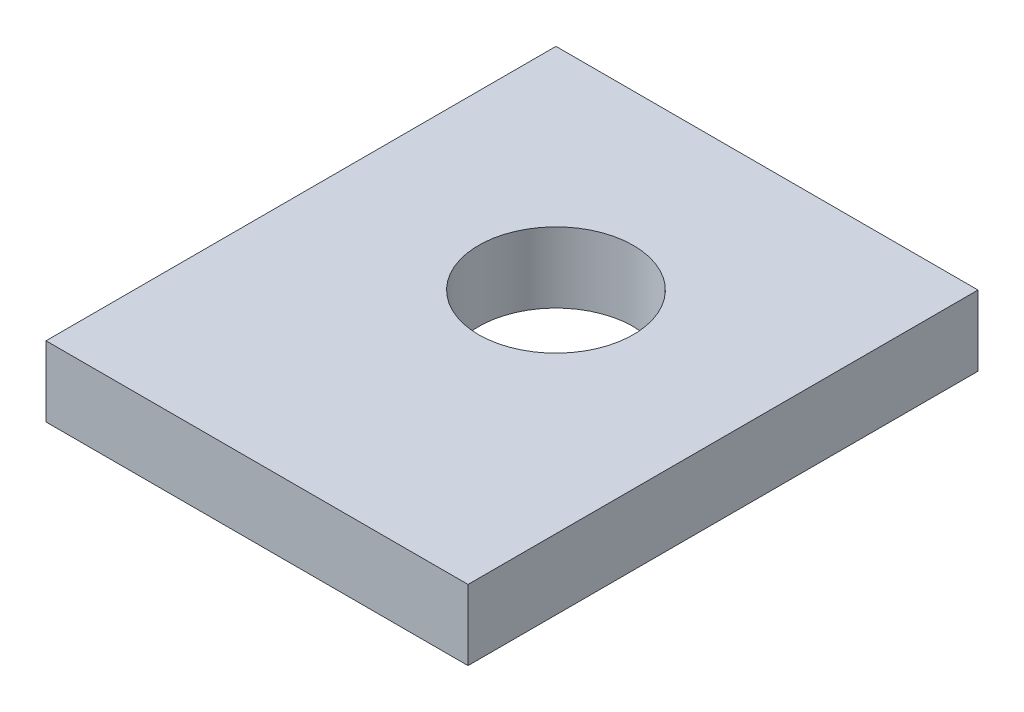
ISO-10303-21;
HEADER;
FILE_DESCRIPTION(('STEP AP214'),'2;1');
FILE_NAME('part.step','',(''),(''),'','','');
FILE_SCHEMA(('AUTOMOTIVE_DESIGN { 1 0 10303 214 1 1 1 1 }'));
ENDSEC;
DATA;
#1=APPLICATION_CONTEXT('core data for automotive mechanical design processes');
#2=APPLICATION_PROTOCOL_DEFINITION('international standard','automotive_design',2000,#1);
#3=PRODUCT_CONTEXT('',#1,'mechanical');
#4=PRODUCT('Part','Part','',(#3));
#5=PRODUCT_RELATED_PRODUCT_CATEGORY('part','',(#4));
#6=PRODUCT_DEFINITION_FORMATION('','',#4);
#7=PRODUCT_DEFINITION_CONTEXT('part definition',#1,'design');
#8=PRODUCT_DEFINITION('design','',#6,#7);
#9=PRODUCT_DEFINITION_SHAPE('','',#8);
#10=(LENGTH_UNIT() NAMED_UNIT(*) SI_UNIT(.MILLI.,.METRE.));
#11=(NAMED_UNIT(*) PLANE_ANGLE_UNIT() SI_UNIT($,.RADIAN.));
#12=(NAMED_UNIT(*) SI_UNIT($,.STERADIAN.) SOLID_ANGLE_UNIT());
#13=UNCERTAINTY_MEASURE_WITH_UNIT(LENGTH_MEASURE(1.E-05),#10,'distance_accuracy_value','');
#14=(GEOMETRIC_REPRESENTATION_CONTEXT(3) GLOBAL_UNCERTAINTY_ASSIGNED_CONTEXT((#13)) GLOBAL_UNIT_ASSIGNED_CONTEXT((#10,
#11,#12)) REPRESENTATION_CONTEXT('',''));
#15=CARTESIAN_POINT('',(0.,0.,0.));
#16=DIRECTION('',(0.,0.,1.));
#17=DIRECTION('',(1.,0.,0.));
#18=AXIS2_PLACEMENT_3D('',#15,#16,#17);
#19=CARTESIAN_POINT('',(0.,-204.2,0.));
#20=DIRECTION('',(0.,-1.,0.));
#21=DIRECTION('',(0.,0.,-1.));
#22=AXIS2_PLACEMENT_3D('',#19,#20,#21);
#23=PLANE('',#22);
#24=DIRECTION('',(0.,0.,1.));
#25=VECTOR('',#24,1.);
#26=CARTESIAN_POINT('',(-16.0091828831705,-204.2,-70.7448828787845));
#27=LINE('',#26,#25);
#28=CARTESIAN_POINT('',(-16.0091828831705,-204.2,-70.7448828787845));
#29=VERTEX_POINT('',#28);
#30=CARTESIAN_POINT('',(-16.0091828831705,-204.2,-63.4948828787845));
#31=VERTEX_POINT('',#30);
#32=EDGE_CURVE('E91',#29,#31,#27,.T.);
#33=ORIENTED_EDGE('',*,*,#32,.T.);
#34=DIRECTION('',(-1.,0.,0.));
#35=VECTOR('',#34,1.);
#36=CARTESIAN_POINT('',(-16.0091828831705,-204.2,-63.4948828787845));
#37=LINE('',#36,#35);
#38=CARTESIAN_POINT('',(-22.0091828831705,-204.2,-63.4948828787845));
#39=VERTEX_POINT('',#38);
#40=EDGE_CURVE('E86',#31,#39,#37,.T.);
#41=ORIENTED_EDGE('',*,*,#40,.T.);
#42=DIRECTION('',(0.,0.,-1.));
#43=VECTOR('',#42,1.);
#44=CARTESIAN_POINT('',(-22.0091828831705,-204.2,-70.7448828787845));
#45=LINE('',#44,#43);
#46=CARTESIAN_POINT('',(-22.0091828831705,-204.2,-70.7448828787845));
#47=VERTEX_POINT('',#46);
#48=EDGE_CURVE('E93',#39,#47,#45,.T.);
#49=ORIENTED_EDGE('',*,*,#48,.T.);
#50=DIRECTION('',(1.,0.,0.));
#51=VECTOR('',#50,1.);
#52=CARTESIAN_POINT('',(-16.0091828831705,-204.2,-70.7448828787845));
#53=LINE('',#52,#51);
#54=EDGE_CURVE('E59',#47,#29,#53,.T.);
#55=ORIENTED_EDGE('',*,*,#54,.T.);
#56=EDGE_LOOP('',(#33,#41,#49,#55));
#57=FACE_BOUND('',#56,.T.);
#58=CARTESIAN_POINT('',(-19.0091828831705,-204.2,-67.7448828787845));
#59=DIRECTION('',(0.,-1.,0.));
#60=DIRECTION('',(0.,0.,-1.));
#61=AXIS2_PLACEMENT_3D('',#58,#59,#60);
#62=CIRCLE('',#61,1.1);
#63=CARTESIAN_POINT('',(-19.0091828831705,-204.2,-68.8448828787845));
#64=VERTEX_POINT('',#63);
#65=EDGE_CURVE('E107',#64,#64,#62,.T.);
#66=ORIENTED_EDGE('',*,*,#65,.F.);
#67=EDGE_LOOP('',(#66));
#68=FACE_BOUND('',#67,.T.);
#69=ADVANCED_FACE('F41',(#57,#68),#23,.T.);
#70=CARTESIAN_POINT('',(0.,-203.2,0.));
#71=DIRECTION('',(0.,-1.,0.));
#72=DIRECTION('',(0.,0.,-1.));
#73=AXIS2_PLACEMENT_3D('',#70,#71,#72);
#74=PLANE('',#73);
#75=DIRECTION('',(0.,0.,1.));
#76=VECTOR('',#75,1.);
#77=CARTESIAN_POINT('',(-16.0091828831705,-203.2,-70.7448828787845));
#78=LINE('',#77,#76);
#79=CARTESIAN_POINT('',(-16.0091828831705,-203.2,-70.7448828787845));
#80=VERTEX_POINT('',#79);
#81=CARTESIAN_POINT('',(-16.0091828831705,-203.2,-63.4948828787845));
#82=VERTEX_POINT('',#81);
#83=EDGE_CURVE('E104',#80,#82,#78,.T.);
#84=ORIENTED_EDGE('',*,*,#83,.F.);
#85=DIRECTION('',(1.,0.,0.));
#86=VECTOR('',#85,1.);
#87=CARTESIAN_POINT('',(-16.0091828831705,-203.2,-70.7448828787845));
#88=LINE('',#87,#86);
#89=CARTESIAN_POINT('',(-22.0091828831705,-203.2,-70.7448828787845));
#90=VERTEX_POINT('',#89);
#91=EDGE_CURVE('E81',#90,#80,#88,.T.);
#92=ORIENTED_EDGE('',*,*,#91,.F.);
#93=DIRECTION('',(0.,0.,-1.));
#94=VECTOR('',#93,1.);
#95=CARTESIAN_POINT('',(-22.0091828831705,-203.2,-70.7448828787845));
#96=LINE('',#95,#94);
#97=CARTESIAN_POINT('',(-22.0091828831705,-203.2,-63.4948828787845));
#98=VERTEX_POINT('',#97);
#99=EDGE_CURVE('E73',#98,#90,#96,.T.);
#100=ORIENTED_EDGE('',*,*,#99,.F.);
#101=DIRECTION('',(-1.,0.,0.));
#102=VECTOR('',#101,1.);
#103=CARTESIAN_POINT('',(-16.0091828831705,-203.2,-63.4948828787845));
#104=LINE('',#103,#102);
#105=EDGE_CURVE('E100',#82,#98,#104,.T.);
#106=ORIENTED_EDGE('',*,*,#105,.F.);
#107=EDGE_LOOP('',(#84,#92,#100,#106));
#108=FACE_BOUND('',#107,.T.);
#109=CARTESIAN_POINT('',(-19.0091828831705,-203.2,-67.7448828787845));
#110=DIRECTION('',(0.,-1.,0.));
#111=DIRECTION('',(0.,0.,-1.));
#112=AXIS2_PLACEMENT_3D('',#109,#110,#111);
#113=CIRCLE('',#112,1.1);
#114=CARTESIAN_POINT('',(-19.0091828831705,-203.2,-68.8448828787845));
#115=VERTEX_POINT('',#114);
#116=EDGE_CURVE('E118',#115,#115,#113,.T.);
#117=ORIENTED_EDGE('',*,*,#116,.T.);
#118=EDGE_LOOP('',(#117));
#119=FACE_BOUND('',#118,.T.);
#120=ADVANCED_FACE('F117',(#108,#119),#74,.F.);
#121=CARTESIAN_POINT('',(-16.0091828831705,-204.2,-70.7448828787845));
#122=DIRECTION('',(-1.,0.,0.));
#123=DIRECTION('',(0.,0.,1.));
#124=AXIS2_PLACEMENT_3D('',#121,#122,#123);
#125=PLANE('',#124);
#126=ORIENTED_EDGE('',*,*,#83,.T.);
#127=DIRECTION('',(0.,1.,0.));
#128=VECTOR('',#127,1.);
#129=CARTESIAN_POINT('',(-16.0091828831705,-204.2,-63.4948828787845));
#130=LINE('',#129,#128);
#131=EDGE_CURVE('E11',#31,#82,#130,.T.);
#132=ORIENTED_EDGE('',*,*,#131,.F.);
#133=ORIENTED_EDGE('',*,*,#32,.F.);
#134=DIRECTION('',(0.,1.,0.));
#135=VECTOR('',#134,1.);
#136=CARTESIAN_POINT('',(-16.0091828831705,-204.2,-70.7448828787845));
#137=LINE('',#136,#135);
#138=EDGE_CURVE('E101',#29,#80,#137,.T.);
#139=ORIENTED_EDGE('',*,*,#138,.T.);
#140=EDGE_LOOP('',(#126,#132,#133,#139));
#141=FACE_BOUND('',#140,.T.);
#142=ADVANCED_FACE('F43',(#141),#125,.F.);
#143=CARTESIAN_POINT('',(-16.0091828831705,-204.2,-63.4948828787845));
#144=DIRECTION('',(0.,0.,-1.));
#145=DIRECTION('',(-1.,0.,0.));
#146=AXIS2_PLACEMENT_3D('',#143,#144,#145);
#147=PLANE('',#146);
#148=ORIENTED_EDGE('',*,*,#105,.T.);
#149=DIRECTION('',(0.,1.,0.));
#150=VECTOR('',#149,1.);
#151=CARTESIAN_POINT('',(-22.0091828831705,-204.2,-63.4948828787845));
#152=LINE('',#151,#150);
#153=EDGE_CURVE('E49',#39,#98,#152,.T.);
#154=ORIENTED_EDGE('',*,*,#153,.F.);
#155=ORIENTED_EDGE('',*,*,#40,.F.);
#156=ORIENTED_EDGE('',*,*,#131,.T.);
#157=EDGE_LOOP('',(#148,#154,#155,#156));
#158=FACE_BOUND('',#157,.T.);
#159=ADVANCED_FACE('F96',(#158),#147,.F.);
#160=CARTESIAN_POINT('',(-22.0091828831705,-204.2,-70.7448828787845));
#161=DIRECTION('',(1.,0.,0.));
#162=DIRECTION('',(0.,0.,-1.));
#163=AXIS2_PLACEMENT_3D('',#160,#161,#162);
#164=PLANE('',#163);
#165=ORIENTED_EDGE('',*,*,#99,.T.);
#166=DIRECTION('',(0.,1.,0.));
#167=VECTOR('',#166,1.);
#168=CARTESIAN_POINT('',(-22.0091828831705,-204.2,-70.7448828787845));
#169=LINE('',#168,#167);
#170=EDGE_CURVE('E98',#47,#90,#169,.T.);
#171=ORIENTED_EDGE('',*,*,#170,.F.);
#172=ORIENTED_EDGE('',*,*,#48,.F.);
#173=ORIENTED_EDGE('',*,*,#153,.T.);
#174=EDGE_LOOP('',(#165,#171,#172,#173));
#175=FACE_BOUND('',#174,.T.);
#176=ADVANCED_FACE('F97',(#175),#164,.F.);
#177=CARTESIAN_POINT('',(-16.0091828831705,-204.2,-70.7448828787845));
#178=DIRECTION('',(0.,0.,1.));
#179=DIRECTION('',(1.,0.,0.));
#180=AXIS2_PLACEMENT_3D('',#177,#178,#179);
#181=PLANE('',#180);
#182=ORIENTED_EDGE('',*,*,#91,.T.);
#183=ORIENTED_EDGE('',*,*,#138,.F.);
#184=ORIENTED_EDGE('',*,*,#54,.F.);
#185=ORIENTED_EDGE('',*,*,#170,.T.);
#186=EDGE_LOOP('',(#182,#183,#184,#185));
#187=FACE_BOUND('',#186,.T.);
#188=ADVANCED_FACE('F114',(#187),#181,.F.);
#189=CARTESIAN_POINT('',(-19.0091828831705,-204.2,-67.7448828787845));
#190=DIRECTION('',(0.,1.,0.));
#191=DIRECTION('',(0.,0.,1.));
#192=AXIS2_PLACEMENT_3D('',#189,#190,#191);
#193=CYLINDRICAL_SURFACE('',#192,1.1);
#194=ORIENTED_EDGE('',*,*,#65,.T.);
#195=EDGE_LOOP('',(#194));
#196=FACE_BOUND('',#195,.T.);
#197=ORIENTED_EDGE('',*,*,#116,.F.);
#198=EDGE_LOOP('',(#197));
#199=FACE_BOUND('',#198,.T.);
#200=ADVANCED_FACE('F127',(#196,#199),#193,.F.);
#201=CLOSED_SHELL('',(#69,#120,#142,#159,#176,#188,#200));
#202=MANIFOLD_SOLID_BREP('B2',#201);
#203=ADVANCED_BREP_SHAPE_REPRESENTATION('',(#18,#202),#14);
#204=SHAPE_DEFINITION_REPRESENTATION(#9,#203);
ENDSEC;
END-ISO-10303-21;
